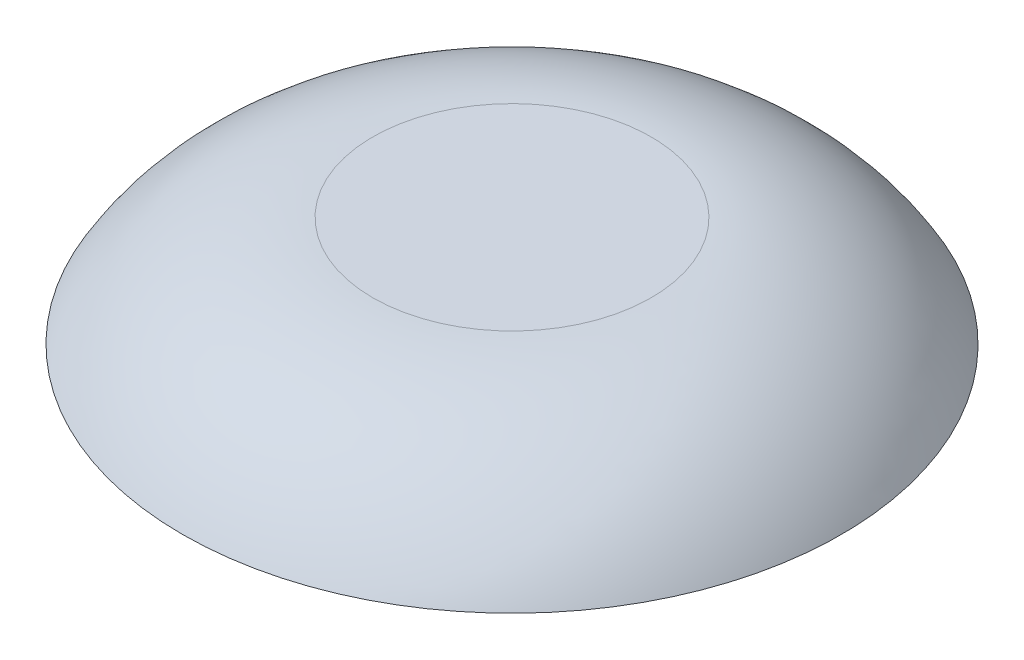
ISO-10303-21;
HEADER;
FILE_DESCRIPTION(('STEP AP214'),'2;1');
FILE_NAME('part.step','',(''),(''),'','','');
FILE_SCHEMA(('AUTOMOTIVE_DESIGN { 1 0 10303 214 1 1 1 1 }'));
ENDSEC;
DATA;
#1=APPLICATION_CONTEXT('core data for automotive mechanical design processes');
#2=APPLICATION_PROTOCOL_DEFINITION('international standard','automotive_design',2000,#1);
#3=PRODUCT_CONTEXT('',#1,'mechanical');
#4=PRODUCT('Part','Part','',(#3));
#5=PRODUCT_RELATED_PRODUCT_CATEGORY('part','',(#4));
#6=PRODUCT_DEFINITION_FORMATION('','',#4);
#7=PRODUCT_DEFINITION_CONTEXT('part definition',#1,'design');
#8=PRODUCT_DEFINITION('design','',#6,#7);
#9=PRODUCT_DEFINITION_SHAPE('','',#8);
#10=(LENGTH_UNIT() NAMED_UNIT(*) SI_UNIT(.MILLI.,.METRE.));
#11=(NAMED_UNIT(*) PLANE_ANGLE_UNIT() SI_UNIT($,.RADIAN.));
#12=(NAMED_UNIT(*) SI_UNIT($,.STERADIAN.) SOLID_ANGLE_UNIT());
#13=UNCERTAINTY_MEASURE_WITH_UNIT(LENGTH_MEASURE(1.E-05),#10,'distance_accuracy_value','');
#14=(GEOMETRIC_REPRESENTATION_CONTEXT(3) GLOBAL_UNCERTAINTY_ASSIGNED_CONTEXT((#13)) GLOBAL_UNIT_ASSIGNED_CONTEXT((#10,
#11,#12)) REPRESENTATION_CONTEXT('',''));
#15=CARTESIAN_POINT('',(0.,0.,0.));
#16=DIRECTION('',(0.,0.,1.));
#17=DIRECTION('',(1.,0.,0.));
#18=AXIS2_PLACEMENT_3D('',#15,#16,#17);
#19=CARTESIAN_POINT('',(0.,5.,0.));
#20=DIRECTION('',(0.,1.,0.));
#21=DIRECTION('',(0.,0.,1.));
#22=AXIS2_PLACEMENT_3D('',#19,#20,#21);
#23=PLANE('',#22);
#24=CARTESIAN_POINT('',(0.,5.,0.));
#25=DIRECTION('',(0.,1.,0.));
#26=DIRECTION('',(0.,0.,1.));
#27=AXIS2_PLACEMENT_3D('',#24,#25,#26);
#28=CIRCLE('',#27,6.33974596215561);
#29=CARTESIAN_POINT('',(0.,5.,6.33974596215561));
#30=VERTEX_POINT('',#29);
#31=EDGE_CURVE('E10',#30,#30,#28,.T.);
#32=ORIENTED_EDGE('',*,*,#31,.T.);
#33=EDGE_LOOP('',(#32));
#34=FACE_BOUND('',#33,.T.);
#35=ADVANCED_FACE('F32',(#34),#23,.T.);
#36=CARTESIAN_POINT('',(0.,0.,0.));
#37=DIRECTION('',(0.,1.,0.));
#38=DIRECTION('',(0.,0.,1.));
#39=AXIS2_PLACEMENT_3D('',#36,#37,#38);
#40=PLANE('',#39);
#41=CARTESIAN_POINT('',(0.,0.,0.));
#42=DIRECTION('',(0.,1.,0.));
#43=DIRECTION('',(0.,0.,1.));
#44=AXIS2_PLACEMENT_3D('',#41,#42,#43);
#45=CIRCLE('',#44,15.);
#46=CARTESIAN_POINT('',(0.,0.,15.));
#47=VERTEX_POINT('',#46);
#48=EDGE_CURVE('E39',#47,#47,#45,.T.);
#49=ORIENTED_EDGE('',*,*,#48,.F.);
#50=EDGE_LOOP('',(#49));
#51=FACE_BOUND('',#50,.T.);
#52=ADVANCED_FACE('F47',(#51),#40,.F.);
#53=CARTESIAN_POINT('',(0.,-5.,0.));
#54=DIRECTION('',(0.,-1.,0.));
#55=DIRECTION('',(0.,0.,-1.));
#56=AXIS2_PLACEMENT_3D('',#53,#54,#55);
#57=DEGENERATE_TOROIDAL_SURFACE('',#56,6.33974596215561,10.,.T.);
#58=ORIENTED_EDGE('',*,*,#48,.T.);
#59=EDGE_LOOP('',(#58));
#60=FACE_BOUND('',#59,.T.);
#61=ORIENTED_EDGE('',*,*,#31,.F.);
#62=EDGE_LOOP('',(#61));
#63=FACE_BOUND('',#62,.T.);
#64=ADVANCED_FACE('F34',(#60,#63),#57,.T.);
#65=CLOSED_SHELL('',(#35,#52,#64));
#66=MANIFOLD_SOLID_BREP('B2',#65);
#67=ADVANCED_BREP_SHAPE_REPRESENTATION('',(#18,#66),#14);
#68=SHAPE_DEFINITION_REPRESENTATION(#9,#67);
ENDSEC;
END-ISO-10303-21;
